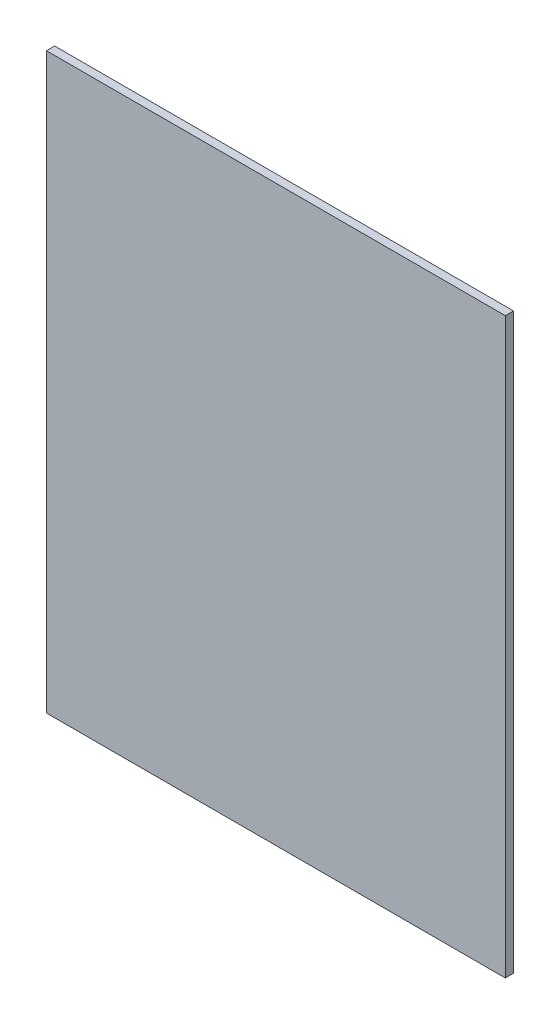
ISO-10303-21;
HEADER;
FILE_DESCRIPTION(('STEP AP214'),'2;1');
FILE_NAME('part.step','',(''),(''),'','','');
FILE_SCHEMA(('AUTOMOTIVE_DESIGN { 1 0 10303 214 1 1 1 1 }'));
ENDSEC;
DATA;
#1=APPLICATION_CONTEXT('core data for automotive mechanical design processes');
#2=APPLICATION_PROTOCOL_DEFINITION('international standard','automotive_design',2000,#1);
#3=PRODUCT_CONTEXT('',#1,'mechanical');
#4=PRODUCT('Part','Part','',(#3));
#5=PRODUCT_RELATED_PRODUCT_CATEGORY('part','',(#4));
#6=PRODUCT_DEFINITION_FORMATION('','',#4);
#7=PRODUCT_DEFINITION_CONTEXT('part definition',#1,'design');
#8=PRODUCT_DEFINITION('design','',#6,#7);
#9=PRODUCT_DEFINITION_SHAPE('','',#8);
#10=(LENGTH_UNIT() NAMED_UNIT(*) SI_UNIT(.MILLI.,.METRE.));
#11=(NAMED_UNIT(*) PLANE_ANGLE_UNIT() SI_UNIT($,.RADIAN.));
#12=(NAMED_UNIT(*) SI_UNIT($,.STERADIAN.) SOLID_ANGLE_UNIT());
#13=UNCERTAINTY_MEASURE_WITH_UNIT(LENGTH_MEASURE(1.E-05),#10,'distance_accuracy_value','');
#14=(GEOMETRIC_REPRESENTATION_CONTEXT(3) GLOBAL_UNCERTAINTY_ASSIGNED_CONTEXT((#13)) GLOBAL_UNIT_ASSIGNED_CONTEXT((#10,
#11,#12)) REPRESENTATION_CONTEXT('',''));
#15=CARTESIAN_POINT('',(0.,0.,0.));
#16=DIRECTION('',(0.,0.,1.));
#17=DIRECTION('',(1.,0.,0.));
#18=AXIS2_PLACEMENT_3D('',#15,#16,#17);
#19=CARTESIAN_POINT('',(0.,0.,10.));
#20=DIRECTION('',(1.,0.,0.));
#21=DIRECTION('',(0.,0.,-1.));
#22=AXIS2_PLACEMENT_3D('',#19,#20,#21);
#23=PLANE('',#22);
#24=DIRECTION('',(0.,-1.,0.));
#25=VECTOR('',#24,1.);
#26=CARTESIAN_POINT('',(0.,0.,0.));
#27=LINE('',#26,#25);
#28=CARTESIAN_POINT('',(0.,0.,0.));
#29=VERTEX_POINT('',#28);
#30=CARTESIAN_POINT('',(0.,-700.,0.));
#31=VERTEX_POINT('',#30);
#32=EDGE_CURVE('E105',#29,#31,#27,.T.);
#33=ORIENTED_EDGE('',*,*,#32,.T.);
#34=DIRECTION('',(0.,0.,-1.));
#35=VECTOR('',#34,1.);
#36=CARTESIAN_POINT('',(0.,-700.,10.));
#37=LINE('',#36,#35);
#38=CARTESIAN_POINT('',(0.,-700.,10.));
#39=VERTEX_POINT('',#38);
#40=EDGE_CURVE('E11',#39,#31,#37,.T.);
#41=ORIENTED_EDGE('',*,*,#40,.F.);
#42=DIRECTION('',(0.,-1.,0.));
#43=VECTOR('',#42,1.);
#44=CARTESIAN_POINT('',(0.,0.,10.));
#45=LINE('',#44,#43);
#46=CARTESIAN_POINT('',(0.,0.,10.));
#47=VERTEX_POINT('',#46);
#48=EDGE_CURVE('E89',#47,#39,#45,.T.);
#49=ORIENTED_EDGE('',*,*,#48,.F.);
#50=DIRECTION('',(0.,0.,-1.));
#51=VECTOR('',#50,1.);
#52=CARTESIAN_POINT('',(0.,0.,10.));
#53=LINE('',#52,#51);
#54=EDGE_CURVE('E98',#47,#29,#53,.T.);
#55=ORIENTED_EDGE('',*,*,#54,.T.);
#56=EDGE_LOOP('',(#33,#41,#49,#55));
#57=FACE_BOUND('',#56,.T.);
#58=ADVANCED_FACE('F39',(#57),#23,.F.);
#59=CARTESIAN_POINT('',(0.,-700.,10.));
#60=DIRECTION('',(0.,1.,0.));
#61=DIRECTION('',(0.,0.,1.));
#62=AXIS2_PLACEMENT_3D('',#59,#60,#61);
#63=PLANE('',#62);
#64=DIRECTION('',(1.,0.,0.));
#65=VECTOR('',#64,1.);
#66=CARTESIAN_POINT('',(0.,-700.,0.));
#67=LINE('',#66,#65);
#68=CARTESIAN_POINT('',(560.,-700.,0.));
#69=VERTEX_POINT('',#68);
#70=EDGE_CURVE('E94',#31,#69,#67,.T.);
#71=ORIENTED_EDGE('',*,*,#70,.T.);
#72=DIRECTION('',(0.,0.,-1.));
#73=VECTOR('',#72,1.);
#74=CARTESIAN_POINT('',(560.,-700.,10.));
#75=LINE('',#74,#73);
#76=CARTESIAN_POINT('',(560.,-700.,10.));
#77=VERTEX_POINT('',#76);
#78=EDGE_CURVE('E50',#77,#69,#75,.T.);
#79=ORIENTED_EDGE('',*,*,#78,.F.);
#80=DIRECTION('',(1.,0.,0.));
#81=VECTOR('',#80,1.);
#82=CARTESIAN_POINT('',(0.,-700.,10.));
#83=LINE('',#82,#81);
#84=EDGE_CURVE('E81',#39,#77,#83,.T.);
#85=ORIENTED_EDGE('',*,*,#84,.F.);
#86=ORIENTED_EDGE('',*,*,#40,.T.);
#87=EDGE_LOOP('',(#71,#79,#85,#86));
#88=FACE_BOUND('',#87,.T.);
#89=ADVANCED_FACE('F91',(#88),#63,.F.);
#90=CARTESIAN_POINT('',(560.,0.,10.));
#91=DIRECTION('',(-1.,0.,0.));
#92=DIRECTION('',(0.,0.,1.));
#93=AXIS2_PLACEMENT_3D('',#90,#91,#92);
#94=PLANE('',#93);
#95=DIRECTION('',(0.,1.,0.));
#96=VECTOR('',#95,1.);
#97=CARTESIAN_POINT('',(560.,0.,0.));
#98=LINE('',#97,#96);
#99=CARTESIAN_POINT('',(560.,0.,0.));
#100=VERTEX_POINT('',#99);
#101=EDGE_CURVE('E75',#69,#100,#98,.T.);
#102=ORIENTED_EDGE('',*,*,#101,.T.);
#103=DIRECTION('',(0.,0.,-1.));
#104=VECTOR('',#103,1.);
#105=CARTESIAN_POINT('',(560.,0.,10.));
#106=LINE('',#105,#104);
#107=CARTESIAN_POINT('',(560.,0.,10.));
#108=VERTEX_POINT('',#107);
#109=EDGE_CURVE('E92',#108,#100,#106,.T.);
#110=ORIENTED_EDGE('',*,*,#109,.F.);
#111=DIRECTION('',(0.,1.,0.));
#112=VECTOR('',#111,1.);
#113=CARTESIAN_POINT('',(560.,0.,10.));
#114=LINE('',#113,#112);
#115=EDGE_CURVE('E86',#77,#108,#114,.T.);
#116=ORIENTED_EDGE('',*,*,#115,.F.);
#117=ORIENTED_EDGE('',*,*,#78,.T.);
#118=EDGE_LOOP('',(#102,#110,#116,#117));
#119=FACE_BOUND('',#118,.T.);
#120=ADVANCED_FACE('F96',(#119),#94,.F.);
#121=CARTESIAN_POINT('',(0.,0.,10.));
#122=DIRECTION('',(0.,-1.,0.));
#123=DIRECTION('',(0.,0.,-1.));
#124=AXIS2_PLACEMENT_3D('',#121,#122,#123);
#125=PLANE('',#124);
#126=DIRECTION('',(-1.,0.,0.));
#127=VECTOR('',#126,1.);
#128=CARTESIAN_POINT('',(0.,0.,0.));
#129=LINE('',#128,#127);
#130=EDGE_CURVE('E77',#100,#29,#129,.T.);
#131=ORIENTED_EDGE('',*,*,#130,.T.);
#132=ORIENTED_EDGE('',*,*,#54,.F.);
#133=DIRECTION('',(-1.,0.,0.));
#134=VECTOR('',#133,1.);
#135=CARTESIAN_POINT('',(0.,0.,10.));
#136=LINE('',#135,#134);
#137=EDGE_CURVE('E54',#108,#47,#136,.T.);
#138=ORIENTED_EDGE('',*,*,#137,.F.);
#139=ORIENTED_EDGE('',*,*,#109,.T.);
#140=EDGE_LOOP('',(#131,#132,#138,#139));
#141=FACE_BOUND('',#140,.T.);
#142=ADVANCED_FACE('F108',(#141),#125,.F.);
#143=CARTESIAN_POINT('',(0.,0.,10.));
#144=DIRECTION('',(0.,0.,1.));
#145=DIRECTION('',(1.,0.,0.));
#146=AXIS2_PLACEMENT_3D('',#143,#144,#145);
#147=PLANE('',#146);
#148=ORIENTED_EDGE('',*,*,#48,.T.);
#149=ORIENTED_EDGE('',*,*,#84,.T.);
#150=ORIENTED_EDGE('',*,*,#115,.T.);
#151=ORIENTED_EDGE('',*,*,#137,.T.);
#152=EDGE_LOOP('',(#148,#149,#150,#151));
#153=FACE_BOUND('',#152,.T.);
#154=ADVANCED_FACE('F88',(#153),#147,.T.);
#155=CARTESIAN_POINT('',(0.,0.,0.));
#156=DIRECTION('',(0.,0.,1.));
#157=DIRECTION('',(1.,0.,0.));
#158=AXIS2_PLACEMENT_3D('',#155,#156,#157);
#159=PLANE('',#158);
#160=ORIENTED_EDGE('',*,*,#32,.F.);
#161=ORIENTED_EDGE('',*,*,#130,.F.);
#162=ORIENTED_EDGE('',*,*,#101,.F.);
#163=ORIENTED_EDGE('',*,*,#70,.F.);
#164=EDGE_LOOP('',(#160,#161,#162,#163));
#165=FACE_BOUND('',#164,.T.);
#166=ADVANCED_FACE('F115',(#165),#159,.F.);
#167=CLOSED_SHELL('',(#58,#89,#120,#142,#154,#166));
#168=MANIFOLD_SOLID_BREP('B2',#167);
#169=ADVANCED_BREP_SHAPE_REPRESENTATION('',(#18,#168),#14);
#170=SHAPE_DEFINITION_REPRESENTATION(#9,#169);
ENDSEC;
END-ISO-10303-21;
